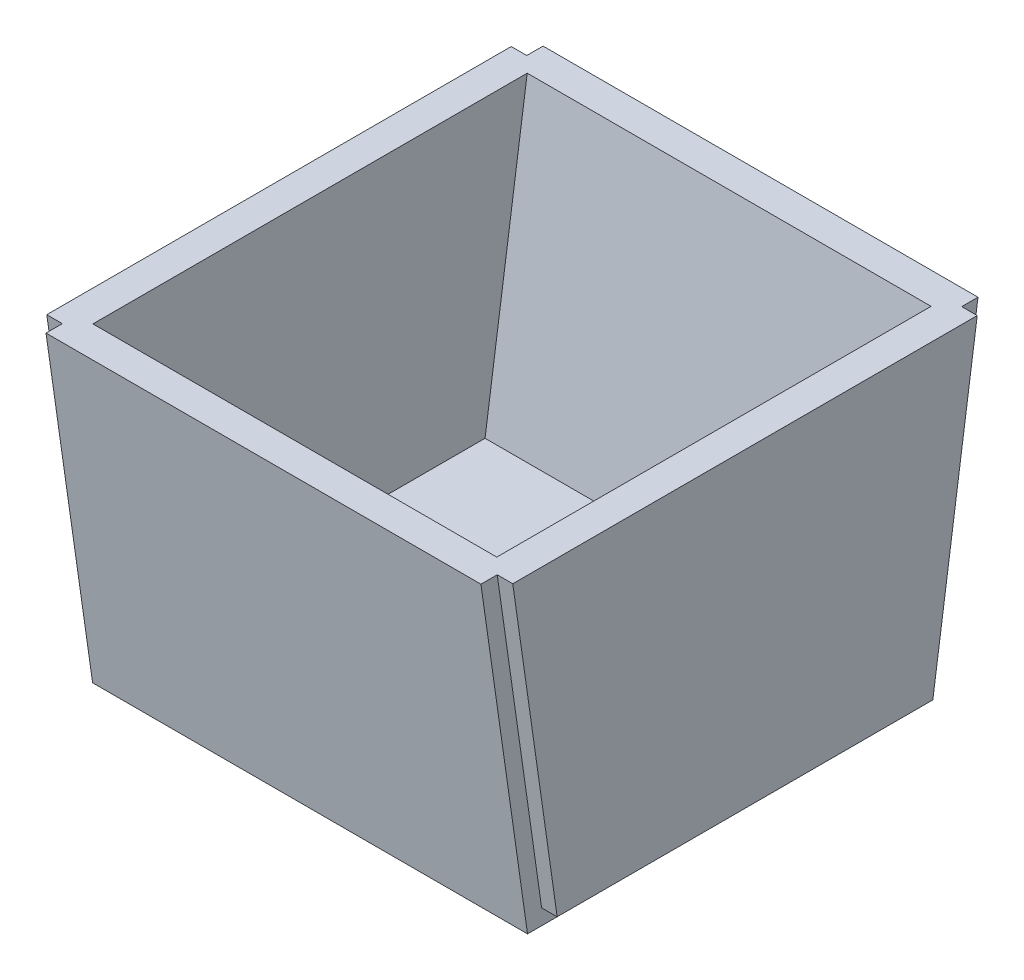
ISO-10303-21;
HEADER;
FILE_DESCRIPTION(('STEP AP214'),'2;1');
FILE_NAME('part.step','',(''),(''),'','','');
FILE_SCHEMA(('AUTOMOTIVE_DESIGN { 1 0 10303 214 1 1 1 1 }'));
ENDSEC;
DATA;
#1=APPLICATION_CONTEXT('core data for automotive mechanical design processes');
#2=APPLICATION_PROTOCOL_DEFINITION('international standard','automotive_design',2000,#1);
#3=PRODUCT_CONTEXT('',#1,'mechanical');
#4=PRODUCT('Part','Part','',(#3));
#5=PRODUCT_RELATED_PRODUCT_CATEGORY('part','',(#4));
#6=PRODUCT_DEFINITION_FORMATION('','',#4);
#7=PRODUCT_DEFINITION_CONTEXT('part definition',#1,'design');
#8=PRODUCT_DEFINITION('design','',#6,#7);
#9=PRODUCT_DEFINITION_SHAPE('','',#8);
#10=(LENGTH_UNIT() NAMED_UNIT(*) SI_UNIT(.MILLI.,.METRE.));
#11=(NAMED_UNIT(*) PLANE_ANGLE_UNIT() SI_UNIT($,.RADIAN.));
#12=(NAMED_UNIT(*) SI_UNIT($,.STERADIAN.) SOLID_ANGLE_UNIT());
#13=UNCERTAINTY_MEASURE_WITH_UNIT(LENGTH_MEASURE(1.E-05),#10,'distance_accuracy_value','');
#14=(GEOMETRIC_REPRESENTATION_CONTEXT(3) GLOBAL_UNCERTAINTY_ASSIGNED_CONTEXT((#13)) GLOBAL_UNIT_ASSIGNED_CONTEXT((#10,
#11,#12)) REPRESENTATION_CONTEXT('',''));
#15=CARTESIAN_POINT('',(0.,0.,0.));
#16=DIRECTION('',(0.,0.,1.));
#17=DIRECTION('',(1.,0.,0.));
#18=AXIS2_PLACEMENT_3D('',#15,#16,#17);
#19=CARTESIAN_POINT('',(-177.8,0.,0.));
#20=DIRECTION('',(1.,0.,0.));
#21=DIRECTION('',(0.,0.,-1.));
#22=AXIS2_PLACEMENT_3D('',#19,#20,#21);
#23=PLANE('',#22);
#24=DIRECTION('',(0.,0.989949493661166,0.141421356237309));
#25=VECTOR('',#24,1.);
#26=CARTESIAN_POINT('',(-177.8,12.7,153.579285714286));
#27=LINE('',#26,#25);
#28=CARTESIAN_POINT('',(-177.8,12.7,153.579285714286));
#29=VERTEX_POINT('',#28);
#30=CARTESIAN_POINT('',(-177.8,266.7,189.865));
#31=VERTEX_POINT('',#30);
#32=EDGE_CURVE('E51',#29,#31,#27,.T.);
#33=ORIENTED_EDGE('',*,*,#32,.F.);
#34=DIRECTION('',(0.,0.,1.));
#35=VECTOR('',#34,1.);
#36=CARTESIAN_POINT('',(-177.8,12.7,-153.579285714286));
#37=LINE('',#36,#35);
#38=CARTESIAN_POINT('',(-177.8,12.7,-153.579285714286));
#39=VERTEX_POINT('',#38);
#40=EDGE_CURVE('E182',#39,#29,#37,.T.);
#41=ORIENTED_EDGE('',*,*,#40,.F.);
#42=DIRECTION('',(0.,-0.989949493661166,0.141421356237309));
#43=VECTOR('',#42,1.);
#44=CARTESIAN_POINT('',(-177.8,266.7,-189.865));
#45=LINE('',#44,#43);
#46=CARTESIAN_POINT('',(-177.8,266.7,-189.865));
#47=VERTEX_POINT('',#46);
#48=EDGE_CURVE('E213',#47,#39,#45,.T.);
#49=ORIENTED_EDGE('',*,*,#48,.F.);
#50=DIRECTION('',(0.,0.,1.));
#51=VECTOR('',#50,1.);
#52=CARTESIAN_POINT('',(-177.8,266.7,-203.2));
#53=LINE('',#52,#51);
#54=CARTESIAN_POINT('',(-177.8,266.7,-203.2));
#55=VERTEX_POINT('',#54);
#56=EDGE_CURVE('E196',#55,#47,#53,.T.);
#57=ORIENTED_EDGE('',*,*,#56,.F.);
#58=DIRECTION('',(0.,0.989949493661166,-0.141421356237309));
#59=VECTOR('',#58,1.);
#60=CARTESIAN_POINT('',(-177.8,0.,-165.1));
#61=LINE('',#60,#59);
#62=CARTESIAN_POINT('',(-177.8,0.,-165.1));
#63=VERTEX_POINT('',#62);
#64=EDGE_CURVE('E325',#63,#55,#61,.T.);
#65=ORIENTED_EDGE('',*,*,#64,.F.);
#66=DIRECTION('',(0.,0.,1.));
#67=VECTOR('',#66,1.);
#68=CARTESIAN_POINT('',(-177.8,0.,-165.1));
#69=LINE('',#68,#67);
#70=CARTESIAN_POINT('',(-177.8,0.,165.1));
#71=VERTEX_POINT('',#70);
#72=EDGE_CURVE('E330',#63,#71,#69,.T.);
#73=ORIENTED_EDGE('',*,*,#72,.T.);
#74=DIRECTION('',(0.,0.989949493661166,0.141421356237309));
#75=VECTOR('',#74,1.);
#76=CARTESIAN_POINT('',(-177.8,0.,165.1));
#77=LINE('',#76,#75);
#78=CARTESIAN_POINT('',(-177.8,266.7,203.2));
#79=VERTEX_POINT('',#78);
#80=EDGE_CURVE('E249',#71,#79,#77,.T.);
#81=ORIENTED_EDGE('',*,*,#80,.T.);
#82=EDGE_CURVE('E69',#31,#79,#53,.T.);
#83=ORIENTED_EDGE('',*,*,#82,.F.);
#84=EDGE_LOOP('',(#33,#41,#49,#57,#65,#73,#81,#83));
#85=FACE_BOUND('',#84,.T.);
#86=ADVANCED_FACE('F46',(#85),#23,.F.);
#87=CARTESIAN_POINT('',(0.,266.7,0.));
#88=DIRECTION('',(0.,1.,0.));
#89=DIRECTION('',(0.,0.,1.));
#90=AXIS2_PLACEMENT_3D('',#87,#88,#89);
#91=PLANE('',#90);
#92=DIRECTION('',(0.,0.,-1.));
#93=VECTOR('',#92,1.);
#94=CARTESIAN_POINT('',(177.8,266.7,-203.2));
#95=LINE('',#94,#93);
#96=CARTESIAN_POINT('',(177.8,266.7,203.2));
#97=VERTEX_POINT('',#96);
#98=CARTESIAN_POINT('',(177.8,266.7,189.865));
#99=VERTEX_POINT('',#98);
#100=EDGE_CURVE('E373',#97,#99,#95,.T.);
#101=ORIENTED_EDGE('',*,*,#100,.T.);
#102=DIRECTION('',(-1.,0.,0.));
#103=VECTOR('',#102,1.);
#104=CARTESIAN_POINT('',(190.5,266.7,189.865));
#105=LINE('',#104,#103);
#106=CARTESIAN_POINT('',(190.5,266.7,189.865));
#107=VERTEX_POINT('',#106);
#108=EDGE_CURVE('E429',#107,#99,#105,.T.);
#109=ORIENTED_EDGE('',*,*,#108,.F.);
#110=DIRECTION('',(0.,0.,-1.));
#111=VECTOR('',#110,1.);
#112=CARTESIAN_POINT('',(190.5,266.7,0.));
#113=LINE('',#112,#111);
#114=CARTESIAN_POINT('',(190.5,266.7,-189.865));
#115=VERTEX_POINT('',#114);
#116=EDGE_CURVE('E410',#107,#115,#113,.T.);
#117=ORIENTED_EDGE('',*,*,#116,.T.);
#118=DIRECTION('',(-1.,0.,0.));
#119=VECTOR('',#118,1.);
#120=CARTESIAN_POINT('',(190.5,266.7,-189.865));
#121=LINE('',#120,#119);
#122=CARTESIAN_POINT('',(177.8,266.7,-189.865));
#123=VERTEX_POINT('',#122);
#124=EDGE_CURVE('E421',#115,#123,#121,.T.);
#125=ORIENTED_EDGE('',*,*,#124,.T.);
#126=CARTESIAN_POINT('',(177.8,266.7,-203.2));
#127=VERTEX_POINT('',#126);
#128=EDGE_CURVE('E276',#123,#127,#95,.T.);
#129=ORIENTED_EDGE('',*,*,#128,.T.);
#130=DIRECTION('',(-1.,0.,0.));
#131=VECTOR('',#130,1.);
#132=CARTESIAN_POINT('',(-177.8,266.7,-203.2));
#133=LINE('',#132,#131);
#134=EDGE_CURVE('E205',#127,#55,#133,.T.);
#135=ORIENTED_EDGE('',*,*,#134,.T.);
#136=ORIENTED_EDGE('',*,*,#56,.T.);
#137=DIRECTION('',(1.,0.,0.));
#138=VECTOR('',#137,1.);
#139=CARTESIAN_POINT('',(-190.5,266.7,-189.865));
#140=LINE('',#139,#138);
#141=CARTESIAN_POINT('',(-190.5,266.7,-189.865));
#142=VERTEX_POINT('',#141);
#143=EDGE_CURVE('E169',#142,#47,#140,.T.);
#144=ORIENTED_EDGE('',*,*,#143,.F.);
#145=DIRECTION('',(0.,0.,-1.));
#146=VECTOR('',#145,1.);
#147=CARTESIAN_POINT('',(-190.5,266.7,189.865));
#148=LINE('',#147,#146);
#149=CARTESIAN_POINT('',(-190.5,266.7,189.865));
#150=VERTEX_POINT('',#149);
#151=EDGE_CURVE('E161',#150,#142,#148,.T.);
#152=ORIENTED_EDGE('',*,*,#151,.F.);
#153=DIRECTION('',(1.,0.,0.));
#154=VECTOR('',#153,1.);
#155=CARTESIAN_POINT('',(-190.5,266.7,189.865));
#156=LINE('',#155,#154);
#157=EDGE_CURVE('E166',#150,#31,#156,.T.);
#158=ORIENTED_EDGE('',*,*,#157,.T.);
#159=ORIENTED_EDGE('',*,*,#82,.T.);
#160=DIRECTION('',(1.,0.,0.));
#161=VECTOR('',#160,1.);
#162=CARTESIAN_POINT('',(-177.8,266.7,203.2));
#163=LINE('',#162,#161);
#164=EDGE_CURVE('E197',#79,#97,#163,.T.);
#165=ORIENTED_EDGE('',*,*,#164,.T.);
#166=EDGE_LOOP('',(#101,#109,#117,#125,#129,#135,#136,#144,#152,#158,#159,#165));
#167=FACE_BOUND('',#166,.T.);
#168=DIRECTION('',(-1.,0.,0.));
#169=VECTOR('',#168,1.);
#170=CARTESIAN_POINT('',(0.,266.7,-177.542125368374));
#171=LINE('',#170,#169);
#172=CARTESIAN_POINT('',(165.1,266.7,-177.542125368374));
#173=VERTEX_POINT('',#172);
#174=CARTESIAN_POINT('',(-165.1,266.7,-177.542125368374));
#175=VERTEX_POINT('',#174);
#176=EDGE_CURVE('E450',#173,#175,#171,.T.);
#177=ORIENTED_EDGE('',*,*,#176,.F.);
#178=DIRECTION('',(0.,0.,-1.));
#179=VECTOR('',#178,1.);
#180=CARTESIAN_POINT('',(165.1,266.7,0.));
#181=LINE('',#180,#179);
#182=CARTESIAN_POINT('',(165.1,266.7,177.542125368374));
#183=VERTEX_POINT('',#182);
#184=EDGE_CURVE('E448',#183,#173,#181,.T.);
#185=ORIENTED_EDGE('',*,*,#184,.F.);
#186=DIRECTION('',(1.,0.,0.));
#187=VECTOR('',#186,1.);
#188=CARTESIAN_POINT('',(0.,266.7,177.542125368374));
#189=LINE('',#188,#187);
#190=CARTESIAN_POINT('',(-165.1,266.7,177.542125368374));
#191=VERTEX_POINT('',#190);
#192=EDGE_CURVE('E455',#191,#183,#189,.T.);
#193=ORIENTED_EDGE('',*,*,#192,.F.);
#194=DIRECTION('',(0.,0.,1.));
#195=VECTOR('',#194,1.);
#196=CARTESIAN_POINT('',(-165.1,266.7,0.));
#197=LINE('',#196,#195);
#198=EDGE_CURVE('E452',#175,#191,#197,.T.);
#199=ORIENTED_EDGE('',*,*,#198,.F.);
#200=EDGE_LOOP('',(#177,#185,#193,#199));
#201=FACE_BOUND('',#200,.T.);
#202=ADVANCED_FACE('F48',(#167,#201),#91,.T.);
#203=CARTESIAN_POINT('',(0.,0.,0.));
#204=DIRECTION('',(0.,1.,0.));
#205=DIRECTION('',(0.,0.,1.));
#206=AXIS2_PLACEMENT_3D('',#203,#204,#205);
#207=PLANE('',#206);
#208=DIRECTION('',(0.,0.,-1.));
#209=VECTOR('',#208,1.);
#210=CARTESIAN_POINT('',(177.8,0.,-165.1));
#211=LINE('',#210,#209);
#212=CARTESIAN_POINT('',(177.8,0.,165.1));
#213=VERTEX_POINT('',#212);
#214=CARTESIAN_POINT('',(177.8,0.,-165.1));
#215=VERTEX_POINT('',#214);
#216=EDGE_CURVE('E284',#213,#215,#211,.T.);
#217=ORIENTED_EDGE('',*,*,#216,.F.);
#218=DIRECTION('',(1.,0.,0.));
#219=VECTOR('',#218,1.);
#220=CARTESIAN_POINT('',(-177.8,0.,165.1));
#221=LINE('',#220,#219);
#222=EDGE_CURVE('E265',#71,#213,#221,.T.);
#223=ORIENTED_EDGE('',*,*,#222,.F.);
#224=ORIENTED_EDGE('',*,*,#72,.F.);
#225=DIRECTION('',(-1.,0.,0.));
#226=VECTOR('',#225,1.);
#227=CARTESIAN_POINT('',(-177.8,0.,-165.1));
#228=LINE('',#227,#226);
#229=EDGE_CURVE('E328',#215,#63,#228,.T.);
#230=ORIENTED_EDGE('',*,*,#229,.F.);
#231=EDGE_LOOP('',(#217,#223,#224,#230));
#232=FACE_BOUND('',#231,.T.);
#233=ADVANCED_FACE('F308',(#232),#207,.F.);
#234=CARTESIAN_POINT('',(0.,-23.114,-161.798));
#235=DIRECTION('',(0.,0.14142135623731,0.989949493661167));
#236=DIRECTION('',(0.,-0.989949493661167,0.14142135623731));
#237=AXIS2_PLACEMENT_3D('',#234,#235,#236);
#238=PLANE('',#237);
#239=ORIENTED_EDGE('',*,*,#64,.T.);
#240=ORIENTED_EDGE('',*,*,#134,.F.);
#241=DIRECTION('',(0.,0.989949493661167,-0.141421356237309));
#242=VECTOR('',#241,1.);
#243=CARTESIAN_POINT('',(177.8,0.,-165.1));
#244=LINE('',#243,#242);
#245=EDGE_CURVE('E257',#215,#127,#244,.T.);
#246=ORIENTED_EDGE('',*,*,#245,.F.);
#247=ORIENTED_EDGE('',*,*,#229,.T.);
#248=EDGE_LOOP('',(#239,#240,#246,#247));
#249=FACE_BOUND('',#248,.T.);
#250=ADVANCED_FACE('F299',(#249),#238,.F.);
#251=CARTESIAN_POINT('',(177.8,0.,0.));
#252=DIRECTION('',(-1.,0.,0.));
#253=DIRECTION('',(0.,0.,1.));
#254=AXIS2_PLACEMENT_3D('',#251,#252,#253);
#255=PLANE('',#254);
#256=ORIENTED_EDGE('',*,*,#128,.F.);
#257=DIRECTION('',(0.,-0.989949493661167,0.141421356237309));
#258=VECTOR('',#257,1.);
#259=CARTESIAN_POINT('',(177.8,-21.2470999999999,-148.7297));
#260=LINE('',#259,#258);
#261=CARTESIAN_POINT('',(177.8,12.7,-153.579285714286));
#262=VERTEX_POINT('',#261);
#263=EDGE_CURVE('E12',#123,#262,#260,.T.);
#264=ORIENTED_EDGE('',*,*,#263,.T.);
#265=DIRECTION('',(0.,0.,1.));
#266=VECTOR('',#265,1.);
#267=CARTESIAN_POINT('',(177.8,12.7,0.));
#268=LINE('',#267,#266);
#269=CARTESIAN_POINT('',(177.8,12.7,153.579285714286));
#270=VERTEX_POINT('',#269);
#271=EDGE_CURVE('E57',#262,#270,#268,.T.);
#272=ORIENTED_EDGE('',*,*,#271,.T.);
#273=DIRECTION('',(0.,0.989949493661167,0.141421356237309));
#274=VECTOR('',#273,1.);
#275=CARTESIAN_POINT('',(177.8,-21.2471,148.7297));
#276=LINE('',#275,#274);
#277=EDGE_CURVE('E638',#270,#99,#276,.T.);
#278=ORIENTED_EDGE('',*,*,#277,.T.);
#279=ORIENTED_EDGE('',*,*,#100,.F.);
#280=DIRECTION('',(0.,0.989949493661166,0.141421356237309));
#281=VECTOR('',#280,1.);
#282=CARTESIAN_POINT('',(177.8,0.,165.1));
#283=LINE('',#282,#281);
#284=EDGE_CURVE('E256',#213,#97,#283,.T.);
#285=ORIENTED_EDGE('',*,*,#284,.F.);
#286=ORIENTED_EDGE('',*,*,#216,.T.);
#287=ORIENTED_EDGE('',*,*,#245,.T.);
#288=EDGE_LOOP('',(#256,#264,#272,#278,#279,#285,#286,#287));
#289=FACE_BOUND('',#288,.T.);
#290=ADVANCED_FACE('F237',(#289),#255,.F.);
#291=CARTESIAN_POINT('',(0.,-23.114,161.798));
#292=DIRECTION('',(0.,0.14142135623731,-0.989949493661167));
#293=DIRECTION('',(0.,0.989949493661167,0.14142135623731));
#294=AXIS2_PLACEMENT_3D('',#291,#292,#293);
#295=PLANE('',#294);
#296=ORIENTED_EDGE('',*,*,#284,.T.);
#297=ORIENTED_EDGE('',*,*,#164,.F.);
#298=ORIENTED_EDGE('',*,*,#80,.F.);
#299=ORIENTED_EDGE('',*,*,#222,.T.);
#300=EDGE_LOOP('',(#296,#297,#298,#299));
#301=FACE_BOUND('',#300,.T.);
#302=ADVANCED_FACE('F240',(#301),#295,.F.);
#303=CARTESIAN_POINT('',(0.,25.4,0.));
#304=DIRECTION('',(0.,1.,0.));
#305=DIRECTION('',(0.,0.,1.));
#306=AXIS2_PLACEMENT_3D('',#303,#304,#305);
#307=PLANE('',#306);
#308=DIRECTION('',(0.,0.,-1.));
#309=VECTOR('',#308,1.);
#310=CARTESIAN_POINT('',(165.1,25.4,0.));
#311=LINE('',#310,#309);
#312=CARTESIAN_POINT('',(165.1,25.4,143.070696796945));
#313=VERTEX_POINT('',#312);
#314=CARTESIAN_POINT('',(165.1,25.4,-143.070696796945));
#315=VERTEX_POINT('',#314);
#316=EDGE_CURVE('E420',#313,#315,#311,.T.);
#317=ORIENTED_EDGE('',*,*,#316,.T.);
#318=DIRECTION('',(-1.,0.,0.));
#319=VECTOR('',#318,1.);
#320=CARTESIAN_POINT('',(0.,25.4,-143.070696796945));
#321=LINE('',#320,#319);
#322=CARTESIAN_POINT('',(-165.1,25.4,-143.070696796945));
#323=VERTEX_POINT('',#322);
#324=EDGE_CURVE('E436',#315,#323,#321,.T.);
#325=ORIENTED_EDGE('',*,*,#324,.T.);
#326=DIRECTION('',(0.,0.,1.));
#327=VECTOR('',#326,1.);
#328=CARTESIAN_POINT('',(-165.1,25.4,0.));
#329=LINE('',#328,#327);
#330=CARTESIAN_POINT('',(-165.1,25.4,143.070696796945));
#331=VERTEX_POINT('',#330);
#332=EDGE_CURVE('E434',#323,#331,#329,.T.);
#333=ORIENTED_EDGE('',*,*,#332,.T.);
#334=DIRECTION('',(1.,0.,0.));
#335=VECTOR('',#334,1.);
#336=CARTESIAN_POINT('',(0.,25.4,143.070696796945));
#337=LINE('',#336,#335);
#338=EDGE_CURVE('E432',#331,#313,#337,.T.);
#339=ORIENTED_EDGE('',*,*,#338,.T.);
#340=EDGE_LOOP('',(#317,#325,#333,#339));
#341=FACE_BOUND('',#340,.T.);
#342=ADVANCED_FACE('F474',(#341),#307,.T.);
#343=CARTESIAN_POINT('',(0.,-19.5218975515723,-136.653282861006));
#344=DIRECTION('',(0.,0.14142135623731,0.989949493661167));
#345=DIRECTION('',(0.,-0.989949493661167,0.14142135623731));
#346=AXIS2_PLACEMENT_3D('',#343,#344,#345);
#347=PLANE('',#346);
#348=DIRECTION('',(0.,0.989949493661167,-0.14142135623731));
#349=VECTOR('',#348,1.);
#350=CARTESIAN_POINT('',(-165.1,-19.5218975515723,-136.653282861006));
#351=LINE('',#350,#349);
#352=EDGE_CURVE('E439',#323,#175,#351,.T.);
#353=ORIENTED_EDGE('',*,*,#352,.F.);
#354=ORIENTED_EDGE('',*,*,#324,.F.);
#355=DIRECTION('',(0.,0.989949493661167,-0.14142135623731));
#356=VECTOR('',#355,1.);
#357=CARTESIAN_POINT('',(165.1,-19.5218975515723,-136.653282861006));
#358=LINE('',#357,#356);
#359=EDGE_CURVE('E442',#315,#173,#358,.T.);
#360=ORIENTED_EDGE('',*,*,#359,.T.);
#361=ORIENTED_EDGE('',*,*,#176,.T.);
#362=EDGE_LOOP('',(#353,#354,#360,#361));
#363=FACE_BOUND('',#362,.T.);
#364=ADVANCED_FACE('F467',(#363),#347,.T.);
#365=CARTESIAN_POINT('',(165.1,0.,0.));
#366=DIRECTION('',(-1.,0.,0.));
#367=DIRECTION('',(0.,0.,1.));
#368=AXIS2_PLACEMENT_3D('',#365,#366,#367);
#369=PLANE('',#368);
#370=ORIENTED_EDGE('',*,*,#359,.F.);
#371=ORIENTED_EDGE('',*,*,#316,.F.);
#372=DIRECTION('',(0.,0.989949493661167,0.14142135623731));
#373=VECTOR('',#372,1.);
#374=CARTESIAN_POINT('',(165.1,-19.5218975515723,136.653282861006));
#375=LINE('',#374,#373);
#376=EDGE_CURVE('E445',#313,#183,#375,.T.);
#377=ORIENTED_EDGE('',*,*,#376,.T.);
#378=ORIENTED_EDGE('',*,*,#184,.T.);
#379=EDGE_LOOP('',(#370,#371,#377,#378));
#380=FACE_BOUND('',#379,.T.);
#381=ADVANCED_FACE('F461',(#380),#369,.T.);
#382=CARTESIAN_POINT('',(-165.1,0.,0.));
#383=DIRECTION('',(1.,0.,0.));
#384=DIRECTION('',(0.,0.,-1.));
#385=AXIS2_PLACEMENT_3D('',#382,#383,#384);
#386=PLANE('',#385);
#387=DIRECTION('',(0.,0.989949493661167,0.14142135623731));
#388=VECTOR('',#387,1.);
#389=CARTESIAN_POINT('',(-165.1,-19.5218975515723,136.653282861006));
#390=LINE('',#389,#388);
#391=EDGE_CURVE('E444',#331,#191,#390,.T.);
#392=ORIENTED_EDGE('',*,*,#391,.F.);
#393=ORIENTED_EDGE('',*,*,#332,.F.);
#394=ORIENTED_EDGE('',*,*,#352,.T.);
#395=ORIENTED_EDGE('',*,*,#198,.T.);
#396=EDGE_LOOP('',(#392,#393,#394,#395));
#397=FACE_BOUND('',#396,.T.);
#398=ADVANCED_FACE('F471',(#397),#386,.T.);
#399=CARTESIAN_POINT('',(0.,-19.5218975515723,136.653282861006));
#400=DIRECTION('',(0.,0.14142135623731,-0.989949493661167));
#401=DIRECTION('',(0.,0.989949493661167,0.14142135623731));
#402=AXIS2_PLACEMENT_3D('',#399,#400,#401);
#403=PLANE('',#402);
#404=ORIENTED_EDGE('',*,*,#376,.F.);
#405=ORIENTED_EDGE('',*,*,#338,.F.);
#406=ORIENTED_EDGE('',*,*,#391,.T.);
#407=ORIENTED_EDGE('',*,*,#192,.T.);
#408=EDGE_LOOP('',(#404,#405,#406,#407));
#409=FACE_BOUND('',#408,.T.);
#410=ADVANCED_FACE('F476',(#409),#403,.T.);
#411=CARTESIAN_POINT('',(190.5,12.7,0.));
#412=DIRECTION('',(0.,-1.,0.));
#413=DIRECTION('',(1.,0.,0.));
#414=AXIS2_PLACEMENT_3D('',#411,#412,#413);
#415=PLANE('',#414);
#416=ORIENTED_EDGE('',*,*,#271,.F.);
#417=DIRECTION('',(-1.,0.,0.));
#418=VECTOR('',#417,1.);
#419=CARTESIAN_POINT('',(190.5,12.7,-153.579285714286));
#420=LINE('',#419,#418);
#421=CARTESIAN_POINT('',(190.5,12.7,-153.579285714286));
#422=VERTEX_POINT('',#421);
#423=EDGE_CURVE('E417',#422,#262,#420,.T.);
#424=ORIENTED_EDGE('',*,*,#423,.F.);
#425=DIRECTION('',(0.,0.,1.));
#426=VECTOR('',#425,1.);
#427=CARTESIAN_POINT('',(190.5,12.7,0.));
#428=LINE('',#427,#426);
#429=CARTESIAN_POINT('',(190.5,12.7,153.579285714286));
#430=VERTEX_POINT('',#429);
#431=EDGE_CURVE('E185',#422,#430,#428,.T.);
#432=ORIENTED_EDGE('',*,*,#431,.T.);
#433=DIRECTION('',(-1.,0.,0.));
#434=VECTOR('',#433,1.);
#435=CARTESIAN_POINT('',(190.5,12.7,153.579285714286));
#436=LINE('',#435,#434);
#437=EDGE_CURVE('E416',#430,#270,#436,.T.);
#438=ORIENTED_EDGE('',*,*,#437,.T.);
#439=EDGE_LOOP('',(#416,#424,#432,#438));
#440=FACE_BOUND('',#439,.T.);
#441=ADVANCED_FACE('F478',(#440),#415,.T.);
#442=CARTESIAN_POINT('',(190.5,-21.2470999999999,-148.7297));
#443=DIRECTION('',(0.,-0.141421356237309,-0.989949493661167));
#444=DIRECTION('',(0.,0.989949493661167,-0.141421356237309));
#445=AXIS2_PLACEMENT_3D('',#442,#443,#444);
#446=PLANE('',#445);
#447=ORIENTED_EDGE('',*,*,#263,.F.);
#448=ORIENTED_EDGE('',*,*,#124,.F.);
#449=DIRECTION('',(0.,-0.989949493661167,0.141421356237309));
#450=VECTOR('',#449,1.);
#451=CARTESIAN_POINT('',(190.5,-21.2470999999999,-148.7297));
#452=LINE('',#451,#450);
#453=EDGE_CURVE('E413',#115,#422,#452,.T.);
#454=ORIENTED_EDGE('',*,*,#453,.T.);
#455=ORIENTED_EDGE('',*,*,#423,.T.);
#456=EDGE_LOOP('',(#447,#448,#454,#455));
#457=FACE_BOUND('',#456,.T.);
#458=ADVANCED_FACE('F483',(#457),#446,.T.);
#459=CARTESIAN_POINT('',(190.5,-21.2471,148.7297));
#460=DIRECTION('',(0.,-0.141421356237309,0.989949493661167));
#461=DIRECTION('',(0.,-0.989949493661167,-0.141421356237309));
#462=AXIS2_PLACEMENT_3D('',#459,#460,#461);
#463=PLANE('',#462);
#464=ORIENTED_EDGE('',*,*,#277,.F.);
#465=ORIENTED_EDGE('',*,*,#437,.F.);
#466=DIRECTION('',(0.,0.989949493661167,0.141421356237309));
#467=VECTOR('',#466,1.);
#468=CARTESIAN_POINT('',(190.5,-21.2471,148.7297));
#469=LINE('',#468,#467);
#470=EDGE_CURVE('E188',#430,#107,#469,.T.);
#471=ORIENTED_EDGE('',*,*,#470,.T.);
#472=ORIENTED_EDGE('',*,*,#108,.T.);
#473=EDGE_LOOP('',(#464,#465,#471,#472));
#474=FACE_BOUND('',#473,.T.);
#475=ADVANCED_FACE('F494',(#474),#463,.T.);
#476=CARTESIAN_POINT('',(190.5,0.,0.));
#477=DIRECTION('',(-1.,0.,0.));
#478=DIRECTION('',(0.,0.,1.));
#479=AXIS2_PLACEMENT_3D('',#476,#477,#478);
#480=PLANE('',#479);
#481=ORIENTED_EDGE('',*,*,#431,.F.);
#482=ORIENTED_EDGE('',*,*,#453,.F.);
#483=ORIENTED_EDGE('',*,*,#116,.F.);
#484=ORIENTED_EDGE('',*,*,#470,.F.);
#485=EDGE_LOOP('',(#481,#482,#483,#484));
#486=FACE_BOUND('',#485,.T.);
#487=ADVANCED_FACE('F497',(#486),#480,.F.);
#488=CARTESIAN_POINT('',(-190.5,12.7,153.579285714286));
#489=DIRECTION('',(0.,0.141421356237309,-0.989949493661167));
#490=DIRECTION('',(0.,0.989949493661167,0.141421356237309));
#491=AXIS2_PLACEMENT_3D('',#488,#489,#490);
#492=PLANE('',#491);
#493=ORIENTED_EDGE('',*,*,#32,.T.);
#494=ORIENTED_EDGE('',*,*,#157,.F.);
#495=DIRECTION('',(0.,0.989949493661166,0.141421356237309));
#496=VECTOR('',#495,1.);
#497=CARTESIAN_POINT('',(-190.5,12.7,153.579285714286));
#498=LINE('',#497,#496);
#499=CARTESIAN_POINT('',(-190.5,12.7,153.579285714286));
#500=VERTEX_POINT('',#499);
#501=EDGE_CURVE('E173',#500,#150,#498,.T.);
#502=ORIENTED_EDGE('',*,*,#501,.F.);
#503=DIRECTION('',(1.,0.,0.));
#504=VECTOR('',#503,1.);
#505=CARTESIAN_POINT('',(-190.5,12.7,153.579285714286));
#506=LINE('',#505,#504);
#507=EDGE_CURVE('E401',#500,#29,#506,.T.);
#508=ORIENTED_EDGE('',*,*,#507,.T.);
#509=EDGE_LOOP('',(#493,#494,#502,#508));
#510=FACE_BOUND('',#509,.T.);
#511=ADVANCED_FACE('F184',(#510),#492,.F.);
#512=CARTESIAN_POINT('',(-190.5,266.7,-189.865));
#513=DIRECTION('',(0.,0.141421356237309,0.989949493661167));
#514=DIRECTION('',(0.,-0.989949493661167,0.141421356237309));
#515=AXIS2_PLACEMENT_3D('',#512,#513,#514);
#516=PLANE('',#515);
#517=ORIENTED_EDGE('',*,*,#48,.T.);
#518=DIRECTION('',(1.,0.,0.));
#519=VECTOR('',#518,1.);
#520=CARTESIAN_POINT('',(-190.5,12.7,-153.579285714286));
#521=LINE('',#520,#519);
#522=CARTESIAN_POINT('',(-190.5,12.7,-153.579285714286));
#523=VERTEX_POINT('',#522);
#524=EDGE_CURVE('E190',#523,#39,#521,.T.);
#525=ORIENTED_EDGE('',*,*,#524,.F.);
#526=DIRECTION('',(0.,-0.989949493661166,0.141421356237309));
#527=VECTOR('',#526,1.);
#528=CARTESIAN_POINT('',(-190.5,266.7,-189.865));
#529=LINE('',#528,#527);
#530=EDGE_CURVE('E172',#142,#523,#529,.T.);
#531=ORIENTED_EDGE('',*,*,#530,.F.);
#532=ORIENTED_EDGE('',*,*,#143,.T.);
#533=EDGE_LOOP('',(#517,#525,#531,#532));
#534=FACE_BOUND('',#533,.T.);
#535=ADVANCED_FACE('F397',(#534),#516,.F.);
#536=CARTESIAN_POINT('',(-190.5,12.7,-153.579285714286));
#537=DIRECTION('',(0.,1.,0.));
#538=DIRECTION('',(-1.,0.,0.));
#539=AXIS2_PLACEMENT_3D('',#536,#537,#538);
#540=PLANE('',#539);
#541=ORIENTED_EDGE('',*,*,#40,.T.);
#542=ORIENTED_EDGE('',*,*,#507,.F.);
#543=DIRECTION('',(0.,0.,1.));
#544=VECTOR('',#543,1.);
#545=CARTESIAN_POINT('',(-190.5,12.7,-153.579285714286));
#546=LINE('',#545,#544);
#547=EDGE_CURVE('E178',#523,#500,#546,.T.);
#548=ORIENTED_EDGE('',*,*,#547,.F.);
#549=ORIENTED_EDGE('',*,*,#524,.T.);
#550=EDGE_LOOP('',(#541,#542,#548,#549));
#551=FACE_BOUND('',#550,.T.);
#552=ADVANCED_FACE('F509',(#551),#540,.F.);
#553=CARTESIAN_POINT('',(-190.5,0.,0.));
#554=DIRECTION('',(-1.,0.,0.));
#555=DIRECTION('',(0.,0.,1.));
#556=AXIS2_PLACEMENT_3D('',#553,#554,#555);
#557=PLANE('',#556);
#558=ORIENTED_EDGE('',*,*,#501,.T.);
#559=ORIENTED_EDGE('',*,*,#151,.T.);
#560=ORIENTED_EDGE('',*,*,#530,.T.);
#561=ORIENTED_EDGE('',*,*,#547,.T.);
#562=EDGE_LOOP('',(#558,#559,#560,#561));
#563=FACE_BOUND('',#562,.T.);
#564=ADVANCED_FACE('F176',(#563),#557,.T.);
#565=CLOSED_SHELL('',(#86,#202,#233,#250,#290,#302,#342,#364,#381,#398,#410,#441,#458,#475,#487,
#511,#535,#552,#564));
#566=MANIFOLD_SOLID_BREP('B2',#565);
#567=ADVANCED_BREP_SHAPE_REPRESENTATION('',(#18,#566),#14);
#568=SHAPE_DEFINITION_REPRESENTATION(#9,#567);
ENDSEC;
END-ISO-10303-21;
